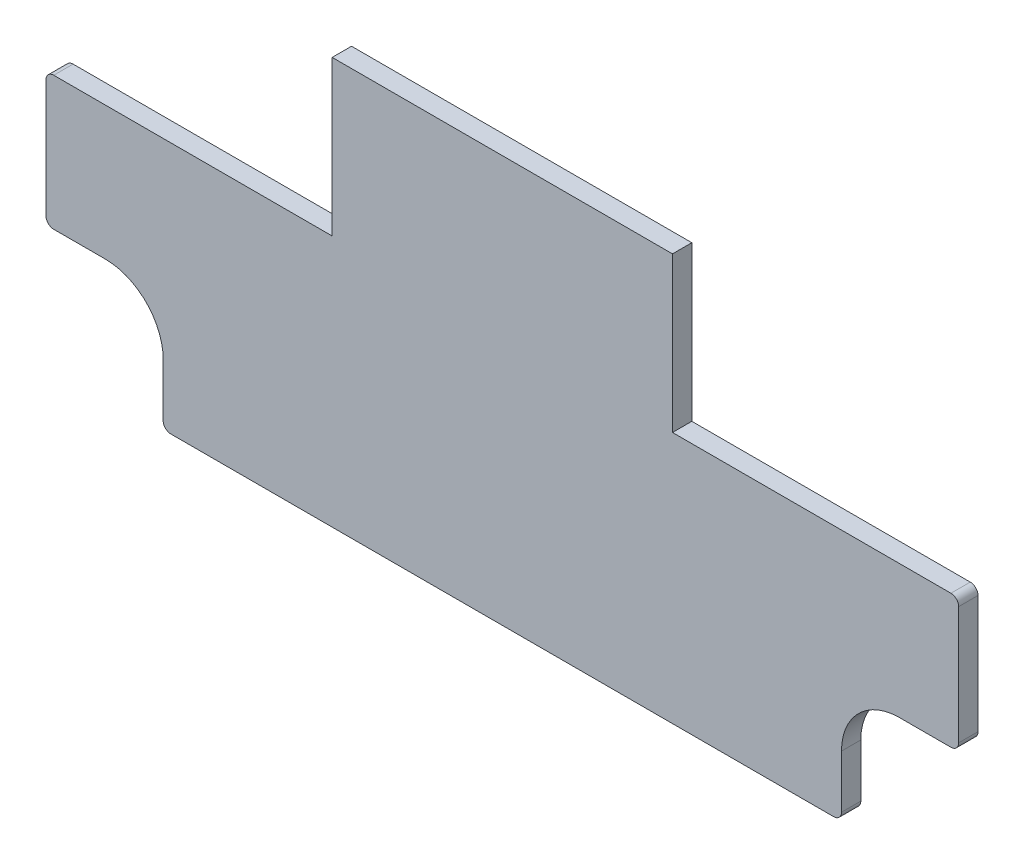
ISO-10303-21;
HEADER;
FILE_DESCRIPTION(('STEP AP214'),'2;1');
FILE_NAME('part.step','',(''),(''),'','','');
FILE_SCHEMA(('AUTOMOTIVE_DESIGN { 1 0 10303 214 1 1 1 1 }'));
ENDSEC;
DATA;
#1=APPLICATION_CONTEXT('core data for automotive mechanical design processes');
#2=APPLICATION_PROTOCOL_DEFINITION('international standard','automotive_design',2000,#1);
#3=PRODUCT_CONTEXT('',#1,'mechanical');
#4=PRODUCT('Part','Part','',(#3));
#5=PRODUCT_RELATED_PRODUCT_CATEGORY('part','',(#4));
#6=PRODUCT_DEFINITION_FORMATION('','',#4);
#7=PRODUCT_DEFINITION_CONTEXT('part definition',#1,'design');
#8=PRODUCT_DEFINITION('design','',#6,#7);
#9=PRODUCT_DEFINITION_SHAPE('','',#8);
#10=(LENGTH_UNIT() NAMED_UNIT(*) SI_UNIT(.MILLI.,.METRE.));
#11=(NAMED_UNIT(*) PLANE_ANGLE_UNIT() SI_UNIT($,.RADIAN.));
#12=(NAMED_UNIT(*) SI_UNIT($,.STERADIAN.) SOLID_ANGLE_UNIT());
#13=UNCERTAINTY_MEASURE_WITH_UNIT(LENGTH_MEASURE(1.E-05),#10,'distance_accuracy_value','');
#14=(GEOMETRIC_REPRESENTATION_CONTEXT(3) GLOBAL_UNCERTAINTY_ASSIGNED_CONTEXT((#13)) GLOBAL_UNIT_ASSIGNED_CONTEXT((#10,
#11,#12)) REPRESENTATION_CONTEXT('',''));
#15=CARTESIAN_POINT('',(0.,0.,0.));
#16=DIRECTION('',(0.,0.,1.));
#17=DIRECTION('',(1.,0.,0.));
#18=AXIS2_PLACEMENT_3D('',#15,#16,#17);
#19=CARTESIAN_POINT('',(205.7,0.,5.));
#20=DIRECTION('',(1.,0.,0.));
#21=DIRECTION('',(0.,0.,-1.));
#22=AXIS2_PLACEMENT_3D('',#19,#20,#21);
#23=PLANE('',#22);
#24=DIRECTION('',(0.,-1.,0.));
#25=VECTOR('',#24,1.);
#26=CARTESIAN_POINT('',(205.7,0.,5.));
#27=LINE('',#26,#25);
#28=CARTESIAN_POINT('',(205.7,15.7,5.));
#29=VERTEX_POINT('',#28);
#30=CARTESIAN_POINT('',(205.7,2.,5.));
#31=VERTEX_POINT('',#30);
#32=EDGE_CURVE('E177',#29,#31,#27,.T.);
#33=ORIENTED_EDGE('',*,*,#32,.T.);
#34=DIRECTION('',(0.,0.,-1.));
#35=VECTOR('',#34,1.);
#36=CARTESIAN_POINT('',(205.7,2.,0.));
#37=LINE('',#36,#35);
#38=CARTESIAN_POINT('',(205.7,2.,0.));
#39=VERTEX_POINT('',#38);
#40=EDGE_CURVE('E315',#31,#39,#37,.T.);
#41=ORIENTED_EDGE('',*,*,#40,.T.);
#42=DIRECTION('',(0.,-1.,0.));
#43=VECTOR('',#42,1.);
#44=CARTESIAN_POINT('',(205.7,0.,0.));
#45=LINE('',#44,#43);
#46=CARTESIAN_POINT('',(205.7,15.7,0.));
#47=VERTEX_POINT('',#46);
#48=EDGE_CURVE('E180',#47,#39,#45,.T.);
#49=ORIENTED_EDGE('',*,*,#48,.F.);
#50=DIRECTION('',(0.,0.,-1.));
#51=VECTOR('',#50,1.);
#52=CARTESIAN_POINT('',(205.7,15.7,5.));
#53=LINE('',#52,#51);
#54=EDGE_CURVE('E174',#29,#47,#53,.T.);
#55=ORIENTED_EDGE('',*,*,#54,.F.);
#56=EDGE_LOOP('',(#33,#41,#49,#55));
#57=FACE_BOUND('',#56,.T.);
#58=ADVANCED_FACE('F35',(#57),#23,.T.);
#59=CARTESIAN_POINT('',(220.7,15.7,5.));
#60=DIRECTION('',(0.,0.,-1.));
#61=DIRECTION('',(-1.,0.,0.));
#62=AXIS2_PLACEMENT_3D('',#59,#60,#61);
#63=CYLINDRICAL_SURFACE('',#62,15.);
#64=CARTESIAN_POINT('',(220.7,15.7,0.));
#65=DIRECTION('',(0.,0.,1.));
#66=DIRECTION('',(1.,0.,0.));
#67=AXIS2_PLACEMENT_3D('',#64,#65,#66);
#68=CIRCLE('',#67,15.);
#69=CARTESIAN_POINT('',(220.7,30.7,0.));
#70=VERTEX_POINT('',#69);
#71=EDGE_CURVE('E231',#70,#47,#68,.T.);
#72=ORIENTED_EDGE('',*,*,#71,.F.);
#73=DIRECTION('',(0.,0.,-1.));
#74=VECTOR('',#73,1.);
#75=CARTESIAN_POINT('',(220.7,30.7,5.));
#76=LINE('',#75,#74);
#77=CARTESIAN_POINT('',(220.7,30.7,5.));
#78=VERTEX_POINT('',#77);
#79=EDGE_CURVE('E186',#78,#70,#76,.T.);
#80=ORIENTED_EDGE('',*,*,#79,.F.);
#81=CARTESIAN_POINT('',(220.7,15.7,5.));
#82=DIRECTION('',(0.,0.,1.));
#83=DIRECTION('',(1.,0.,0.));
#84=AXIS2_PLACEMENT_3D('',#81,#82,#83);
#85=CIRCLE('',#84,15.);
#86=EDGE_CURVE('E192',#78,#29,#85,.T.);
#87=ORIENTED_EDGE('',*,*,#86,.T.);
#88=ORIENTED_EDGE('',*,*,#54,.T.);
#89=EDGE_LOOP('',(#72,#80,#87,#88));
#90=FACE_BOUND('',#89,.T.);
#91=ADVANCED_FACE('F198',(#90),#63,.F.);
#92=CARTESIAN_POINT('',(0.,30.7,5.));
#93=DIRECTION('',(0.,-1.,0.));
#94=DIRECTION('',(0.,0.,-1.));
#95=AXIS2_PLACEMENT_3D('',#92,#93,#94);
#96=PLANE('',#95);
#97=DIRECTION('',(-1.,0.,0.));
#98=VECTOR('',#97,1.);
#99=CARTESIAN_POINT('',(0.,30.7,0.));
#100=LINE('',#99,#98);
#101=CARTESIAN_POINT('',(234.,30.7,0.));
#102=VERTEX_POINT('',#101);
#103=EDGE_CURVE('E233',#102,#70,#100,.T.);
#104=ORIENTED_EDGE('',*,*,#103,.F.);
#105=DIRECTION('',(0.,0.,-1.));
#106=VECTOR('',#105,1.);
#107=CARTESIAN_POINT('',(234.,30.7,5.));
#108=LINE('',#107,#106);
#109=CARTESIAN_POINT('',(234.,30.7,5.));
#110=VERTEX_POINT('',#109);
#111=EDGE_CURVE('E43',#102,#110,#108,.F.);
#112=ORIENTED_EDGE('',*,*,#111,.T.);
#113=DIRECTION('',(-1.,0.,0.));
#114=VECTOR('',#113,1.);
#115=CARTESIAN_POINT('',(0.,30.7,5.));
#116=LINE('',#115,#114);
#117=EDGE_CURVE('E200',#110,#78,#116,.T.);
#118=ORIENTED_EDGE('',*,*,#117,.T.);
#119=ORIENTED_EDGE('',*,*,#79,.T.);
#120=EDGE_LOOP('',(#104,#112,#118,#119));
#121=FACE_BOUND('',#120,.T.);
#122=ADVANCED_FACE('F324',(#121),#96,.T.);
#123=CARTESIAN_POINT('',(236.,0.,5.));
#124=DIRECTION('',(-1.,0.,0.));
#125=DIRECTION('',(0.,0.,1.));
#126=AXIS2_PLACEMENT_3D('',#123,#124,#125);
#127=PLANE('',#126);
#128=DIRECTION('',(0.,1.,0.));
#129=VECTOR('',#128,1.);
#130=CARTESIAN_POINT('',(236.,0.,5.));
#131=LINE('',#130,#129);
#132=CARTESIAN_POINT('',(236.,32.7,5.));
#133=VERTEX_POINT('',#132);
#134=CARTESIAN_POINT('',(236.,63.2,5.));
#135=VERTEX_POINT('',#134);
#136=EDGE_CURVE('E202',#133,#135,#131,.T.);
#137=ORIENTED_EDGE('',*,*,#136,.F.);
#138=DIRECTION('',(0.,0.,-1.));
#139=VECTOR('',#138,1.);
#140=CARTESIAN_POINT('',(236.,32.7,0.));
#141=LINE('',#140,#139);
#142=CARTESIAN_POINT('',(236.,32.7,0.));
#143=VERTEX_POINT('',#142);
#144=EDGE_CURVE('E319',#133,#143,#141,.T.);
#145=ORIENTED_EDGE('',*,*,#144,.T.);
#146=DIRECTION('',(0.,1.,0.));
#147=VECTOR('',#146,1.);
#148=CARTESIAN_POINT('',(236.,0.,0.));
#149=LINE('',#148,#147);
#150=CARTESIAN_POINT('',(236.,63.2,0.));
#151=VERTEX_POINT('',#150);
#152=EDGE_CURVE('E235',#143,#151,#149,.T.);
#153=ORIENTED_EDGE('',*,*,#152,.T.);
#154=DIRECTION('',(0.,0.,-1.));
#155=VECTOR('',#154,1.);
#156=CARTESIAN_POINT('',(236.,63.2,5.));
#157=LINE('',#156,#155);
#158=EDGE_CURVE('E317',#151,#135,#157,.F.);
#159=ORIENTED_EDGE('',*,*,#158,.T.);
#160=EDGE_LOOP('',(#137,#145,#153,#159));
#161=FACE_BOUND('',#160,.T.);
#162=ADVANCED_FACE('F332',(#161),#127,.F.);
#163=CARTESIAN_POINT('',(0.,65.2,5.));
#164=DIRECTION('',(0.,-1.,0.));
#165=DIRECTION('',(1.,0.,0.));
#166=AXIS2_PLACEMENT_3D('',#163,#164,#165);
#167=PLANE('',#166);
#168=DIRECTION('',(-1.,0.,0.));
#169=VECTOR('',#168,1.);
#170=CARTESIAN_POINT('',(0.,65.2,5.));
#171=LINE('',#170,#169);
#172=CARTESIAN_POINT('',(234.,65.2,5.));
#173=VERTEX_POINT('',#172);
#174=CARTESIAN_POINT('',(162.,65.2,5.));
#175=VERTEX_POINT('',#174);
#176=EDGE_CURVE('E207',#173,#175,#171,.T.);
#177=ORIENTED_EDGE('',*,*,#176,.F.);
#178=DIRECTION('',(0.,0.,-1.));
#179=VECTOR('',#178,1.);
#180=CARTESIAN_POINT('',(234.,65.2,5.));
#181=LINE('',#180,#179);
#182=CARTESIAN_POINT('',(234.,65.2,0.));
#183=VERTEX_POINT('',#182);
#184=EDGE_CURVE('E11',#173,#183,#181,.T.);
#185=ORIENTED_EDGE('',*,*,#184,.T.);
#186=DIRECTION('',(-1.,0.,0.));
#187=VECTOR('',#186,1.);
#188=CARTESIAN_POINT('',(0.,65.2,0.));
#189=LINE('',#188,#187);
#190=CARTESIAN_POINT('',(162.,65.2,0.));
#191=VERTEX_POINT('',#190);
#192=EDGE_CURVE('E238',#183,#191,#189,.T.);
#193=ORIENTED_EDGE('',*,*,#192,.T.);
#194=DIRECTION('',(0.,0.,-1.));
#195=VECTOR('',#194,1.);
#196=CARTESIAN_POINT('',(162.,65.2,5.));
#197=LINE('',#196,#195);
#198=EDGE_CURVE('E274',#175,#191,#197,.T.);
#199=ORIENTED_EDGE('',*,*,#198,.F.);
#200=EDGE_LOOP('',(#177,#185,#193,#199));
#201=FACE_BOUND('',#200,.T.);
#202=ADVANCED_FACE('F344',(#201),#167,.F.);
#203=CARTESIAN_POINT('',(162.,0.,5.));
#204=DIRECTION('',(-1.,0.,0.));
#205=DIRECTION('',(0.,0.,1.));
#206=AXIS2_PLACEMENT_3D('',#203,#204,#205);
#207=PLANE('',#206);
#208=DIRECTION('',(0.,1.,0.));
#209=VECTOR('',#208,1.);
#210=CARTESIAN_POINT('',(162.,0.,0.));
#211=LINE('',#210,#209);
#212=CARTESIAN_POINT('',(162.,105.2,0.));
#213=VERTEX_POINT('',#212);
#214=EDGE_CURVE('E240',#191,#213,#211,.T.);
#215=ORIENTED_EDGE('',*,*,#214,.T.);
#216=DIRECTION('',(0.,0.,-1.));
#217=VECTOR('',#216,1.);
#218=CARTESIAN_POINT('',(162.,105.2,5.));
#219=LINE('',#218,#217);
#220=CARTESIAN_POINT('',(162.,105.2,5.));
#221=VERTEX_POINT('',#220);
#222=EDGE_CURVE('E271',#221,#213,#219,.T.);
#223=ORIENTED_EDGE('',*,*,#222,.F.);
#224=DIRECTION('',(0.,1.,0.));
#225=VECTOR('',#224,1.);
#226=CARTESIAN_POINT('',(162.,0.,5.));
#227=LINE('',#226,#225);
#228=EDGE_CURVE('E209',#175,#221,#227,.T.);
#229=ORIENTED_EDGE('',*,*,#228,.F.);
#230=ORIENTED_EDGE('',*,*,#198,.T.);
#231=EDGE_LOOP('',(#215,#223,#229,#230));
#232=FACE_BOUND('',#231,.T.);
#233=ADVANCED_FACE('F351',(#232),#207,.F.);
#234=CARTESIAN_POINT('',(0.,105.2,5.));
#235=DIRECTION('',(0.,-1.,0.));
#236=DIRECTION('',(0.,0.,-1.));
#237=AXIS2_PLACEMENT_3D('',#234,#235,#236);
#238=PLANE('',#237);
#239=DIRECTION('',(-1.,0.,0.));
#240=VECTOR('',#239,1.);
#241=CARTESIAN_POINT('',(0.,105.2,0.));
#242=LINE('',#241,#240);
#243=CARTESIAN_POINT('',(74.,105.2,0.));
#244=VERTEX_POINT('',#243);
#245=EDGE_CURVE('E242',#213,#244,#242,.T.);
#246=ORIENTED_EDGE('',*,*,#245,.T.);
#247=DIRECTION('',(0.,0.,-1.));
#248=VECTOR('',#247,1.);
#249=CARTESIAN_POINT('',(74.,105.2,5.));
#250=LINE('',#249,#248);
#251=CARTESIAN_POINT('',(74.,105.2,5.));
#252=VERTEX_POINT('',#251);
#253=EDGE_CURVE('E268',#252,#244,#250,.T.);
#254=ORIENTED_EDGE('',*,*,#253,.F.);
#255=DIRECTION('',(-1.,0.,0.));
#256=VECTOR('',#255,1.);
#257=CARTESIAN_POINT('',(0.,105.2,5.));
#258=LINE('',#257,#256);
#259=EDGE_CURVE('E211',#221,#252,#258,.T.);
#260=ORIENTED_EDGE('',*,*,#259,.F.);
#261=ORIENTED_EDGE('',*,*,#222,.T.);
#262=EDGE_LOOP('',(#246,#254,#260,#261));
#263=FACE_BOUND('',#262,.T.);
#264=ADVANCED_FACE('F354',(#263),#238,.F.);
#265=CARTESIAN_POINT('',(74.,0.,5.));
#266=DIRECTION('',(1.,0.,0.));
#267=DIRECTION('',(0.,0.,-1.));
#268=AXIS2_PLACEMENT_3D('',#265,#266,#267);
#269=PLANE('',#268);
#270=DIRECTION('',(0.,-1.,0.));
#271=VECTOR('',#270,1.);
#272=CARTESIAN_POINT('',(74.,0.,0.));
#273=LINE('',#272,#271);
#274=CARTESIAN_POINT('',(74.,65.2,0.));
#275=VERTEX_POINT('',#274);
#276=EDGE_CURVE('E244',#244,#275,#273,.T.);
#277=ORIENTED_EDGE('',*,*,#276,.T.);
#278=DIRECTION('',(0.,0.,-1.));
#279=VECTOR('',#278,1.);
#280=CARTESIAN_POINT('',(74.,65.2,5.));
#281=LINE('',#280,#279);
#282=CARTESIAN_POINT('',(74.,65.2,5.));
#283=VERTEX_POINT('',#282);
#284=EDGE_CURVE('E265',#283,#275,#281,.T.);
#285=ORIENTED_EDGE('',*,*,#284,.F.);
#286=DIRECTION('',(0.,-1.,0.));
#287=VECTOR('',#286,1.);
#288=CARTESIAN_POINT('',(74.,0.,5.));
#289=LINE('',#288,#287);
#290=EDGE_CURVE('E213',#252,#283,#289,.T.);
#291=ORIENTED_EDGE('',*,*,#290,.F.);
#292=ORIENTED_EDGE('',*,*,#253,.T.);
#293=EDGE_LOOP('',(#277,#285,#291,#292));
#294=FACE_BOUND('',#293,.T.);
#295=ADVANCED_FACE('F359',(#294),#269,.F.);
#296=CARTESIAN_POINT('',(0.,65.2,5.));
#297=DIRECTION('',(0.,-1.,0.));
#298=DIRECTION('',(0.,0.,-1.));
#299=AXIS2_PLACEMENT_3D('',#296,#297,#298);
#300=PLANE('',#299);
#301=DIRECTION('',(-1.,0.,0.));
#302=VECTOR('',#301,1.);
#303=CARTESIAN_POINT('',(0.,65.2,0.));
#304=LINE('',#303,#302);
#305=CARTESIAN_POINT('',(2.,65.2,0.));
#306=VERTEX_POINT('',#305);
#307=EDGE_CURVE('E246',#275,#306,#304,.T.);
#308=ORIENTED_EDGE('',*,*,#307,.T.);
#309=DIRECTION('',(0.,0.,-1.));
#310=VECTOR('',#309,1.);
#311=CARTESIAN_POINT('',(2.,65.2,5.));
#312=LINE('',#311,#310);
#313=CARTESIAN_POINT('',(2.,65.2,5.));
#314=VERTEX_POINT('',#313);
#315=EDGE_CURVE('E294',#306,#314,#312,.F.);
#316=ORIENTED_EDGE('',*,*,#315,.T.);
#317=DIRECTION('',(-1.,0.,0.));
#318=VECTOR('',#317,1.);
#319=CARTESIAN_POINT('',(0.,65.2,5.));
#320=LINE('',#319,#318);
#321=EDGE_CURVE('E215',#283,#314,#320,.T.);
#322=ORIENTED_EDGE('',*,*,#321,.F.);
#323=ORIENTED_EDGE('',*,*,#284,.T.);
#324=EDGE_LOOP('',(#308,#316,#322,#323));
#325=FACE_BOUND('',#324,.T.);
#326=ADVANCED_FACE('F503',(#325),#300,.F.);
#327=CARTESIAN_POINT('',(0.,0.,5.));
#328=DIRECTION('',(1.,0.,0.));
#329=DIRECTION('',(0.,1.,0.));
#330=AXIS2_PLACEMENT_3D('',#327,#328,#329);
#331=PLANE('',#330);
#332=DIRECTION('',(0.,-1.,0.));
#333=VECTOR('',#332,1.);
#334=CARTESIAN_POINT('',(0.,0.,5.));
#335=LINE('',#334,#333);
#336=CARTESIAN_POINT('',(0.,63.2,5.));
#337=VERTEX_POINT('',#336);
#338=CARTESIAN_POINT('',(0.,32.7,5.));
#339=VERTEX_POINT('',#338);
#340=EDGE_CURVE('E217',#337,#339,#335,.T.);
#341=ORIENTED_EDGE('',*,*,#340,.F.);
#342=DIRECTION('',(0.,0.,-1.));
#343=VECTOR('',#342,1.);
#344=CARTESIAN_POINT('',(0.,63.2,5.));
#345=LINE('',#344,#343);
#346=CARTESIAN_POINT('',(0.,63.2,0.));
#347=VERTEX_POINT('',#346);
#348=EDGE_CURVE('E279',#337,#347,#345,.T.);
#349=ORIENTED_EDGE('',*,*,#348,.T.);
#350=DIRECTION('',(0.,-1.,0.));
#351=VECTOR('',#350,1.);
#352=CARTESIAN_POINT('',(0.,0.,0.));
#353=LINE('',#352,#351);
#354=CARTESIAN_POINT('',(0.,32.7,0.));
#355=VERTEX_POINT('',#354);
#356=EDGE_CURVE('E249',#347,#355,#353,.T.);
#357=ORIENTED_EDGE('',*,*,#356,.T.);
#358=DIRECTION('',(0.,0.,-1.));
#359=VECTOR('',#358,1.);
#360=CARTESIAN_POINT('',(0.,32.7,5.));
#361=LINE('',#360,#359);
#362=EDGE_CURVE('E185',#355,#339,#361,.F.);
#363=ORIENTED_EDGE('',*,*,#362,.T.);
#364=EDGE_LOOP('',(#341,#349,#357,#363));
#365=FACE_BOUND('',#364,.T.);
#366=ADVANCED_FACE('F369',(#365),#331,.F.);
#367=CARTESIAN_POINT('',(0.,30.7,5.));
#368=DIRECTION('',(0.,1.,0.));
#369=DIRECTION('',(0.,0.,1.));
#370=AXIS2_PLACEMENT_3D('',#367,#368,#369);
#371=PLANE('',#370);
#372=DIRECTION('',(1.,0.,0.));
#373=VECTOR('',#372,1.);
#374=CARTESIAN_POINT('',(0.,30.7,5.));
#375=LINE('',#374,#373);
#376=CARTESIAN_POINT('',(2.,30.7,5.));
#377=VERTEX_POINT('',#376);
#378=CARTESIAN_POINT('',(15.3,30.7,5.));
#379=VERTEX_POINT('',#378);
#380=EDGE_CURVE('E220',#377,#379,#375,.T.);
#381=ORIENTED_EDGE('',*,*,#380,.F.);
#382=DIRECTION('',(0.,0.,-1.));
#383=VECTOR('',#382,1.);
#384=CARTESIAN_POINT('',(2.,30.7,5.));
#385=LINE('',#384,#383);
#386=CARTESIAN_POINT('',(2.,30.7,0.));
#387=VERTEX_POINT('',#386);
#388=EDGE_CURVE('E306',#377,#387,#385,.T.);
#389=ORIENTED_EDGE('',*,*,#388,.T.);
#390=DIRECTION('',(1.,0.,0.));
#391=VECTOR('',#390,1.);
#392=CARTESIAN_POINT('',(0.,30.7,0.));
#393=LINE('',#392,#391);
#394=CARTESIAN_POINT('',(15.3,30.7,0.));
#395=VERTEX_POINT('',#394);
#396=EDGE_CURVE('E252',#387,#395,#393,.T.);
#397=ORIENTED_EDGE('',*,*,#396,.T.);
#398=DIRECTION('',(0.,0.,-1.));
#399=VECTOR('',#398,1.);
#400=CARTESIAN_POINT('',(15.3,30.7,5.));
#401=LINE('',#400,#399);
#402=EDGE_CURVE('E262',#379,#395,#401,.T.);
#403=ORIENTED_EDGE('',*,*,#402,.F.);
#404=EDGE_LOOP('',(#381,#389,#397,#403));
#405=FACE_BOUND('',#404,.T.);
#406=ADVANCED_FACE('F379',(#405),#371,.F.);
#407=CARTESIAN_POINT('',(15.3,15.7,5.));
#408=DIRECTION('',(0.,0.,-1.));
#409=DIRECTION('',(-1.,0.,0.));
#410=AXIS2_PLACEMENT_3D('',#407,#408,#409);
#411=CYLINDRICAL_SURFACE('',#410,15.);
#412=CARTESIAN_POINT('',(15.3,15.7,0.));
#413=DIRECTION('',(0.,0.,1.));
#414=DIRECTION('',(1.,0.,0.));
#415=AXIS2_PLACEMENT_3D('',#412,#413,#414);
#416=CIRCLE('',#415,15.);
#417=CARTESIAN_POINT('',(30.3,15.7,0.));
#418=VERTEX_POINT('',#417);
#419=EDGE_CURVE('E254',#418,#395,#416,.T.);
#420=ORIENTED_EDGE('',*,*,#419,.F.);
#421=DIRECTION('',(0.,0.,-1.));
#422=VECTOR('',#421,1.);
#423=CARTESIAN_POINT('',(30.3,15.7,5.));
#424=LINE('',#423,#422);
#425=CARTESIAN_POINT('',(30.3,15.7,5.));
#426=VERTEX_POINT('',#425);
#427=EDGE_CURVE('E229',#426,#418,#424,.T.);
#428=ORIENTED_EDGE('',*,*,#427,.F.);
#429=CARTESIAN_POINT('',(15.3,15.7,5.));
#430=DIRECTION('',(0.,0.,1.));
#431=DIRECTION('',(1.,0.,0.));
#432=AXIS2_PLACEMENT_3D('',#429,#430,#431);
#433=CIRCLE('',#432,15.);
#434=EDGE_CURVE('E222',#426,#379,#433,.T.);
#435=ORIENTED_EDGE('',*,*,#434,.T.);
#436=ORIENTED_EDGE('',*,*,#402,.T.);
#437=EDGE_LOOP('',(#420,#428,#435,#436));
#438=FACE_BOUND('',#437,.T.);
#439=ADVANCED_FACE('F385',(#438),#411,.F.);
#440=CARTESIAN_POINT('',(30.3,0.,5.));
#441=DIRECTION('',(1.,0.,0.));
#442=DIRECTION('',(0.,1.,0.));
#443=AXIS2_PLACEMENT_3D('',#440,#441,#442);
#444=PLANE('',#443);
#445=DIRECTION('',(0.,-1.,0.));
#446=VECTOR('',#445,1.);
#447=CARTESIAN_POINT('',(30.3,0.,0.));
#448=LINE('',#447,#446);
#449=CARTESIAN_POINT('',(30.3,2.,0.));
#450=VERTEX_POINT('',#449);
#451=EDGE_CURVE('E257',#418,#450,#448,.T.);
#452=ORIENTED_EDGE('',*,*,#451,.T.);
#453=DIRECTION('',(0.,0.,-1.));
#454=VECTOR('',#453,1.);
#455=CARTESIAN_POINT('',(30.3,2.,5.));
#456=LINE('',#455,#454);
#457=CARTESIAN_POINT('',(30.3,2.,5.));
#458=VERTEX_POINT('',#457);
#459=EDGE_CURVE('E313',#450,#458,#456,.F.);
#460=ORIENTED_EDGE('',*,*,#459,.T.);
#461=DIRECTION('',(0.,-1.,0.));
#462=VECTOR('',#461,1.);
#463=CARTESIAN_POINT('',(30.3,0.,5.));
#464=LINE('',#463,#462);
#465=EDGE_CURVE('E225',#426,#458,#464,.T.);
#466=ORIENTED_EDGE('',*,*,#465,.F.);
#467=ORIENTED_EDGE('',*,*,#427,.T.);
#468=EDGE_LOOP('',(#452,#460,#466,#467));
#469=FACE_BOUND('',#468,.T.);
#470=ADVANCED_FACE('F388',(#469),#444,.F.);
#471=CARTESIAN_POINT('',(0.,0.,5.));
#472=DIRECTION('',(0.,1.,0.));
#473=DIRECTION('',(0.,0.,1.));
#474=AXIS2_PLACEMENT_3D('',#471,#472,#473);
#475=PLANE('',#474);
#476=DIRECTION('',(1.,0.,0.));
#477=VECTOR('',#476,1.);
#478=CARTESIAN_POINT('',(0.,0.,5.));
#479=LINE('',#478,#477);
#480=CARTESIAN_POINT('',(32.3,0.,5.));
#481=VERTEX_POINT('',#480);
#482=CARTESIAN_POINT('',(203.7,0.,5.));
#483=VERTEX_POINT('',#482);
#484=EDGE_CURVE('E227',#481,#483,#479,.T.);
#485=ORIENTED_EDGE('',*,*,#484,.F.);
#486=DIRECTION('',(0.,0.,-1.));
#487=VECTOR('',#486,1.);
#488=CARTESIAN_POINT('',(32.3,0.,5.));
#489=LINE('',#488,#487);
#490=CARTESIAN_POINT('',(32.3,0.,0.));
#491=VERTEX_POINT('',#490);
#492=EDGE_CURVE('E310',#481,#491,#489,.T.);
#493=ORIENTED_EDGE('',*,*,#492,.T.);
#494=DIRECTION('',(1.,0.,0.));
#495=VECTOR('',#494,1.);
#496=CARTESIAN_POINT('',(0.,0.,0.));
#497=LINE('',#496,#495);
#498=CARTESIAN_POINT('',(203.7,0.,0.));
#499=VERTEX_POINT('',#498);
#500=EDGE_CURVE('E195',#491,#499,#497,.T.);
#501=ORIENTED_EDGE('',*,*,#500,.T.);
#502=DIRECTION('',(0.,0.,-1.));
#503=VECTOR('',#502,1.);
#504=CARTESIAN_POINT('',(203.7,0.,5.));
#505=LINE('',#504,#503);
#506=EDGE_CURVE('E50',#499,#483,#505,.F.);
#507=ORIENTED_EDGE('',*,*,#506,.T.);
#508=EDGE_LOOP('',(#485,#493,#501,#507));
#509=FACE_BOUND('',#508,.T.);
#510=ADVANCED_FACE('F394',(#509),#475,.F.);
#511=CARTESIAN_POINT('',(0.,0.,5.));
#512=DIRECTION('',(0.,0.,1.));
#513=DIRECTION('',(1.,0.,0.));
#514=AXIS2_PLACEMENT_3D('',#511,#512,#513);
#515=PLANE('',#514);
#516=ORIENTED_EDGE('',*,*,#321,.T.);
#517=CARTESIAN_POINT('',(2.,63.2,5.));
#518=DIRECTION('',(0.,0.,1.));
#519=DIRECTION('',(1.,0.,0.));
#520=AXIS2_PLACEMENT_3D('',#517,#518,#519);
#521=CIRCLE('',#520,2.);
#522=EDGE_CURVE('E304',#314,#337,#521,.T.);
#523=ORIENTED_EDGE('',*,*,#522,.T.);
#524=ORIENTED_EDGE('',*,*,#340,.T.);
#525=CARTESIAN_POINT('',(2.,32.7,5.));
#526=DIRECTION('',(0.,0.,1.));
#527=DIRECTION('',(1.,0.,0.));
#528=AXIS2_PLACEMENT_3D('',#525,#526,#527);
#529=CIRCLE('',#528,2.);
#530=EDGE_CURVE('E302',#339,#377,#529,.T.);
#531=ORIENTED_EDGE('',*,*,#530,.T.);
#532=ORIENTED_EDGE('',*,*,#380,.T.);
#533=ORIENTED_EDGE('',*,*,#434,.F.);
#534=ORIENTED_EDGE('',*,*,#465,.T.);
#535=CARTESIAN_POINT('',(32.3,2.,5.));
#536=DIRECTION('',(0.,0.,1.));
#537=DIRECTION('',(1.,0.,0.));
#538=AXIS2_PLACEMENT_3D('',#535,#536,#537);
#539=CIRCLE('',#538,2.);
#540=EDGE_CURVE('E57',#458,#481,#539,.T.);
#541=ORIENTED_EDGE('',*,*,#540,.T.);
#542=ORIENTED_EDGE('',*,*,#484,.T.);
#543=CARTESIAN_POINT('',(203.7,2.,5.));
#544=DIRECTION('',(0.,0.,1.));
#545=DIRECTION('',(1.,0.,0.));
#546=AXIS2_PLACEMENT_3D('',#543,#544,#545);
#547=CIRCLE('',#546,2.);
#548=EDGE_CURVE('E194',#483,#31,#547,.T.);
#549=ORIENTED_EDGE('',*,*,#548,.T.);
#550=ORIENTED_EDGE('',*,*,#32,.F.);
#551=ORIENTED_EDGE('',*,*,#86,.F.);
#552=ORIENTED_EDGE('',*,*,#117,.F.);
#553=CARTESIAN_POINT('',(234.,32.7,5.));
#554=DIRECTION('',(0.,0.,1.));
#555=DIRECTION('',(1.,0.,0.));
#556=AXIS2_PLACEMENT_3D('',#553,#554,#555);
#557=CIRCLE('',#556,2.);
#558=EDGE_CURVE('E298',#110,#133,#557,.T.);
#559=ORIENTED_EDGE('',*,*,#558,.T.);
#560=ORIENTED_EDGE('',*,*,#136,.T.);
#561=CARTESIAN_POINT('',(234.,63.2,5.));
#562=DIRECTION('',(0.,0.,1.));
#563=DIRECTION('',(1.,0.,0.));
#564=AXIS2_PLACEMENT_3D('',#561,#562,#563);
#565=CIRCLE('',#564,2.);
#566=EDGE_CURVE('E296',#135,#173,#565,.T.);
#567=ORIENTED_EDGE('',*,*,#566,.T.);
#568=ORIENTED_EDGE('',*,*,#176,.T.);
#569=ORIENTED_EDGE('',*,*,#228,.T.);
#570=ORIENTED_EDGE('',*,*,#259,.T.);
#571=ORIENTED_EDGE('',*,*,#290,.T.);
#572=EDGE_LOOP('',(#516,#523,#524,#531,#532,#533,#534,#541,#542,#549,#550,#551,#552,#559,#560,
#567,#568,#569,#570,#571));
#573=FACE_BOUND('',#572,.T.);
#574=ADVANCED_FACE('F190',(#573),#515,.T.);
#575=CARTESIAN_POINT('',(0.,0.,0.));
#576=DIRECTION('',(0.,0.,1.));
#577=DIRECTION('',(1.,0.,0.));
#578=AXIS2_PLACEMENT_3D('',#575,#576,#577);
#579=PLANE('',#578);
#580=ORIENTED_EDGE('',*,*,#356,.F.);
#581=CARTESIAN_POINT('',(2.,63.2,0.));
#582=DIRECTION('',(0.,0.,1.));
#583=DIRECTION('',(1.,0.,0.));
#584=AXIS2_PLACEMENT_3D('',#581,#582,#583);
#585=CIRCLE('',#584,2.);
#586=EDGE_CURVE('E292',#347,#306,#585,.F.);
#587=ORIENTED_EDGE('',*,*,#586,.T.);
#588=ORIENTED_EDGE('',*,*,#307,.F.);
#589=ORIENTED_EDGE('',*,*,#276,.F.);
#590=ORIENTED_EDGE('',*,*,#245,.F.);
#591=ORIENTED_EDGE('',*,*,#214,.F.);
#592=ORIENTED_EDGE('',*,*,#192,.F.);
#593=CARTESIAN_POINT('',(234.,63.2,0.));
#594=DIRECTION('',(0.,0.,1.));
#595=DIRECTION('',(1.,0.,0.));
#596=AXIS2_PLACEMENT_3D('',#593,#594,#595);
#597=CIRCLE('',#596,2.);
#598=EDGE_CURVE('E282',#183,#151,#597,.F.);
#599=ORIENTED_EDGE('',*,*,#598,.T.);
#600=ORIENTED_EDGE('',*,*,#152,.F.);
#601=CARTESIAN_POINT('',(234.,32.7,0.));
#602=DIRECTION('',(0.,0.,1.));
#603=DIRECTION('',(1.,0.,0.));
#604=AXIS2_PLACEMENT_3D('',#601,#602,#603);
#605=CIRCLE('',#604,2.);
#606=EDGE_CURVE('E284',#143,#102,#605,.F.);
#607=ORIENTED_EDGE('',*,*,#606,.T.);
#608=ORIENTED_EDGE('',*,*,#103,.T.);
#609=ORIENTED_EDGE('',*,*,#71,.T.);
#610=ORIENTED_EDGE('',*,*,#48,.T.);
#611=CARTESIAN_POINT('',(203.7,2.,0.));
#612=DIRECTION('',(0.,0.,1.));
#613=DIRECTION('',(1.,0.,0.));
#614=AXIS2_PLACEMENT_3D('',#611,#612,#613);
#615=CIRCLE('',#614,2.);
#616=EDGE_CURVE('E286',#39,#499,#615,.F.);
#617=ORIENTED_EDGE('',*,*,#616,.T.);
#618=ORIENTED_EDGE('',*,*,#500,.F.);
#619=CARTESIAN_POINT('',(32.3,2.,0.));
#620=DIRECTION('',(0.,0.,1.));
#621=DIRECTION('',(1.,0.,0.));
#622=AXIS2_PLACEMENT_3D('',#619,#620,#621);
#623=CIRCLE('',#622,2.);
#624=EDGE_CURVE('E288',#491,#450,#623,.F.);
#625=ORIENTED_EDGE('',*,*,#624,.T.);
#626=ORIENTED_EDGE('',*,*,#451,.F.);
#627=ORIENTED_EDGE('',*,*,#419,.T.);
#628=ORIENTED_EDGE('',*,*,#396,.F.);
#629=CARTESIAN_POINT('',(2.,32.7,0.));
#630=DIRECTION('',(0.,0.,1.));
#631=DIRECTION('',(1.,0.,0.));
#632=AXIS2_PLACEMENT_3D('',#629,#630,#631);
#633=CIRCLE('',#632,2.);
#634=EDGE_CURVE('E290',#387,#355,#633,.F.);
#635=ORIENTED_EDGE('',*,*,#634,.T.);
#636=EDGE_LOOP('',(#580,#587,#588,#589,#590,#591,#592,#599,#600,#607,#608,#609,#610,#617,#618,
#625,#626,#627,#628,#635));
#637=FACE_BOUND('',#636,.T.);
#638=ADVANCED_FACE('F336',(#637),#579,.F.);
#639=CARTESIAN_POINT('',(2.,63.2,5.));
#640=DIRECTION('',(0.,0.,-1.));
#641=DIRECTION('',(-1.,0.,0.));
#642=AXIS2_PLACEMENT_3D('',#639,#640,#641);
#643=CYLINDRICAL_SURFACE('',#642,2.);
#644=ORIENTED_EDGE('',*,*,#522,.F.);
#645=ORIENTED_EDGE('',*,*,#315,.F.);
#646=ORIENTED_EDGE('',*,*,#586,.F.);
#647=ORIENTED_EDGE('',*,*,#348,.F.);
#648=EDGE_LOOP('',(#644,#645,#646,#647));
#649=FACE_BOUND('',#648,.T.);
#650=ADVANCED_FACE('F367',(#649),#643,.T.);
#651=CARTESIAN_POINT('',(2.,32.7,5.));
#652=DIRECTION('',(0.,0.,-1.));
#653=DIRECTION('',(-1.,0.,0.));
#654=AXIS2_PLACEMENT_3D('',#651,#652,#653);
#655=CYLINDRICAL_SURFACE('',#654,2.);
#656=ORIENTED_EDGE('',*,*,#530,.F.);
#657=ORIENTED_EDGE('',*,*,#362,.F.);
#658=ORIENTED_EDGE('',*,*,#634,.F.);
#659=ORIENTED_EDGE('',*,*,#388,.F.);
#660=EDGE_LOOP('',(#656,#657,#658,#659));
#661=FACE_BOUND('',#660,.T.);
#662=ADVANCED_FACE('F376',(#661),#655,.T.);
#663=CARTESIAN_POINT('',(32.3,2.,5.));
#664=DIRECTION('',(0.,0.,-1.));
#665=DIRECTION('',(-1.,0.,0.));
#666=AXIS2_PLACEMENT_3D('',#663,#664,#665);
#667=CYLINDRICAL_SURFACE('',#666,2.);
#668=ORIENTED_EDGE('',*,*,#540,.F.);
#669=ORIENTED_EDGE('',*,*,#459,.F.);
#670=ORIENTED_EDGE('',*,*,#624,.F.);
#671=ORIENTED_EDGE('',*,*,#492,.F.);
#672=EDGE_LOOP('',(#668,#669,#670,#671));
#673=FACE_BOUND('',#672,.T.);
#674=ADVANCED_FACE('F391',(#673),#667,.T.);
#675=CARTESIAN_POINT('',(203.7,2.,5.));
#676=DIRECTION('',(0.,0.,1.));
#677=DIRECTION('',(1.,0.,0.));
#678=AXIS2_PLACEMENT_3D('',#675,#676,#677);
#679=CYLINDRICAL_SURFACE('',#678,2.);
#680=ORIENTED_EDGE('',*,*,#548,.F.);
#681=ORIENTED_EDGE('',*,*,#506,.F.);
#682=ORIENTED_EDGE('',*,*,#616,.F.);
#683=ORIENTED_EDGE('',*,*,#40,.F.);
#684=EDGE_LOOP('',(#680,#681,#682,#683));
#685=FACE_BOUND('',#684,.T.);
#686=ADVANCED_FACE('F396',(#685),#679,.T.);
#687=CARTESIAN_POINT('',(234.,32.7,5.));
#688=DIRECTION('',(0.,0.,1.));
#689=DIRECTION('',(1.,0.,0.));
#690=AXIS2_PLACEMENT_3D('',#687,#688,#689);
#691=CYLINDRICAL_SURFACE('',#690,2.);
#692=ORIENTED_EDGE('',*,*,#558,.F.);
#693=ORIENTED_EDGE('',*,*,#111,.F.);
#694=ORIENTED_EDGE('',*,*,#606,.F.);
#695=ORIENTED_EDGE('',*,*,#144,.F.);
#696=EDGE_LOOP('',(#692,#693,#694,#695));
#697=FACE_BOUND('',#696,.T.);
#698=ADVANCED_FACE('F329',(#697),#691,.T.);
#699=CARTESIAN_POINT('',(234.,63.2,5.));
#700=DIRECTION('',(0.,0.,-1.));
#701=DIRECTION('',(-1.,0.,0.));
#702=AXIS2_PLACEMENT_3D('',#699,#700,#701);
#703=CYLINDRICAL_SURFACE('',#702,2.);
#704=ORIENTED_EDGE('',*,*,#566,.F.);
#705=ORIENTED_EDGE('',*,*,#158,.F.);
#706=ORIENTED_EDGE('',*,*,#598,.F.);
#707=ORIENTED_EDGE('',*,*,#184,.F.);
#708=EDGE_LOOP('',(#704,#705,#706,#707));
#709=FACE_BOUND('',#708,.T.);
#710=ADVANCED_FACE('F37',(#709),#703,.T.);
#711=CLOSED_SHELL('',(#58,#91,#122,#162,#202,#233,#264,#295,#326,#366,#406,#439,#470,#510,#574,
#638,#650,#662,#674,#686,#698,#710));
#712=MANIFOLD_SOLID_BREP('B2',#711);
#713=ADVANCED_BREP_SHAPE_REPRESENTATION('',(#18,#712),#14);
#714=SHAPE_DEFINITION_REPRESENTATION(#9,#713);
ENDSEC;
END-ISO-10303-21;
